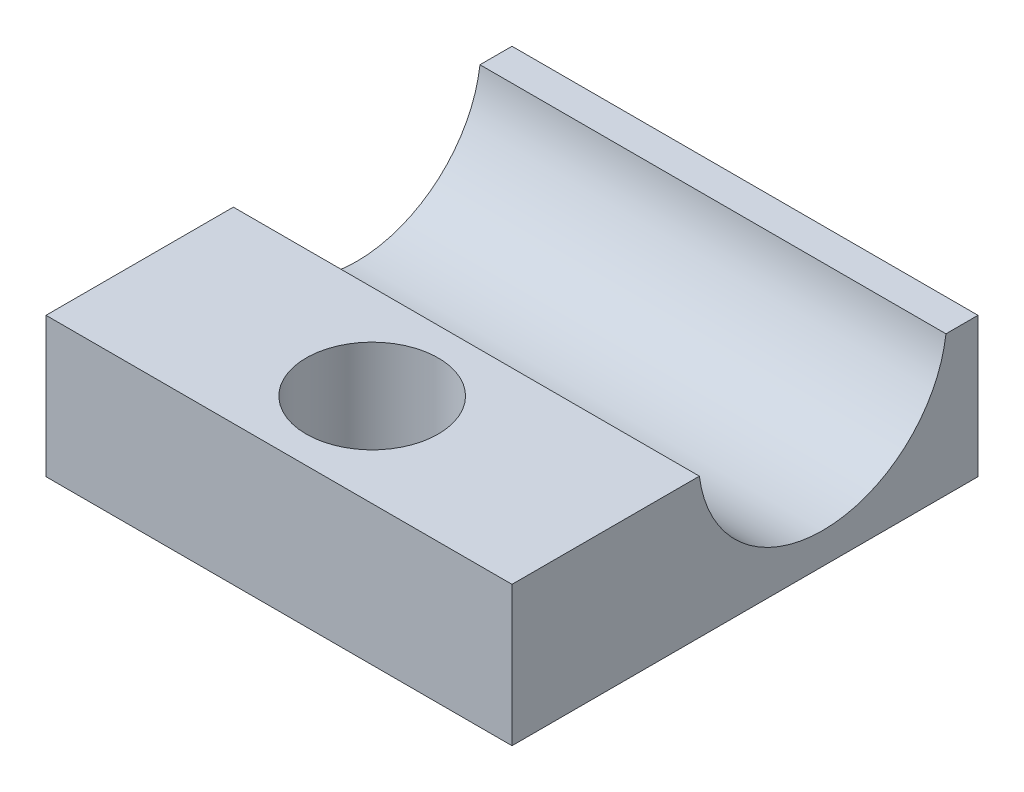
ISO-10303-21;
HEADER;
FILE_DESCRIPTION(('STEP AP214'),'2;1');
FILE_NAME('part.step','',(''),(''),'','','');
FILE_SCHEMA(('AUTOMOTIVE_DESIGN { 1 0 10303 214 1 1 1 1 }'));
ENDSEC;
DATA;
#1=APPLICATION_CONTEXT('core data for automotive mechanical design processes');
#2=APPLICATION_PROTOCOL_DEFINITION('international standard','automotive_design',2000,#1);
#3=PRODUCT_CONTEXT('',#1,'mechanical');
#4=PRODUCT('Part','Part','',(#3));
#5=PRODUCT_RELATED_PRODUCT_CATEGORY('part','',(#4));
#6=PRODUCT_DEFINITION_FORMATION('','',#4);
#7=PRODUCT_DEFINITION_CONTEXT('part definition',#1,'design');
#8=PRODUCT_DEFINITION('design','',#6,#7);
#9=PRODUCT_DEFINITION_SHAPE('','',#8);
#10=(LENGTH_UNIT() NAMED_UNIT(*) SI_UNIT(.MILLI.,.METRE.));
#11=(NAMED_UNIT(*) PLANE_ANGLE_UNIT() SI_UNIT($,.RADIAN.));
#12=(NAMED_UNIT(*) SI_UNIT($,.STERADIAN.) SOLID_ANGLE_UNIT());
#13=UNCERTAINTY_MEASURE_WITH_UNIT(LENGTH_MEASURE(1.E-05),#10,'distance_accuracy_value','');
#14=(GEOMETRIC_REPRESENTATION_CONTEXT(3) GLOBAL_UNCERTAINTY_ASSIGNED_CONTEXT((#13)) GLOBAL_UNIT_ASSIGNED_CONTEXT((#10,
#11,#12)) REPRESENTATION_CONTEXT('',''));
#15=CARTESIAN_POINT('',(0.,0.,0.));
#16=DIRECTION('',(0.,0.,1.));
#17=DIRECTION('',(1.,0.,0.));
#18=AXIS2_PLACEMENT_3D('',#15,#16,#17);
#19=CARTESIAN_POINT('',(0.,4.5,0.));
#20=DIRECTION('',(0.,1.,0.));
#21=DIRECTION('',(0.,0.,1.));
#22=AXIS2_PLACEMENT_3D('',#19,#20,#21);
#23=PLANE('',#22);
#24=DIRECTION('',(1.,0.,0.));
#25=VECTOR('',#24,1.);
#26=CARTESIAN_POINT('',(-15.0010000000001,4.5,-6.03137303340308));
#27=LINE('',#26,#25);
#28=CARTESIAN_POINT('',(0.,4.5,-6.03137303340308));
#29=VERTEX_POINT('',#28);
#30=CARTESIAN_POINT('',(-15.0000000000001,4.5,-6.03137303340308));
#31=VERTEX_POINT('',#30);
#32=EDGE_CURVE('E51',#29,#31,#27,.F.);
#33=ORIENTED_EDGE('',*,*,#32,.T.);
#34=DIRECTION('',(0.,0.,1.));
#35=VECTOR('',#34,1.);
#36=CARTESIAN_POINT('',(-15.0000000000001,4.5,-15.));
#37=LINE('',#36,#35);
#38=CARTESIAN_POINT('',(-15.0000000000001,4.5,0.));
#39=VERTEX_POINT('',#38);
#40=EDGE_CURVE('E88',#31,#39,#37,.T.);
#41=ORIENTED_EDGE('',*,*,#40,.T.);
#42=DIRECTION('',(1.,0.,0.));
#43=VECTOR('',#42,1.);
#44=CARTESIAN_POINT('',(-15.0000000000001,4.5,0.));
#45=LINE('',#44,#43);
#46=CARTESIAN_POINT('',(0.,4.5,0.));
#47=VERTEX_POINT('',#46);
#48=EDGE_CURVE('E111',#39,#47,#45,.T.);
#49=ORIENTED_EDGE('',*,*,#48,.T.);
#50=DIRECTION('',(0.,0.,-1.));
#51=VECTOR('',#50,1.);
#52=CARTESIAN_POINT('',(0.,4.5,-15.));
#53=LINE('',#52,#51);
#54=EDGE_CURVE('E118',#47,#29,#53,.T.);
#55=ORIENTED_EDGE('',*,*,#54,.T.);
#56=EDGE_LOOP('',(#33,#41,#49,#55));
#57=FACE_BOUND('',#56,.T.);
#58=CARTESIAN_POINT('',(-7.5,4.5,-3.));
#59=DIRECTION('',(0.,1.,0.));
#60=DIRECTION('',(0.,0.,1.));
#61=AXIS2_PLACEMENT_3D('',#58,#59,#60);
#62=CIRCLE('',#61,2.125);
#63=CARTESIAN_POINT('',(-7.5,4.5,-0.875000000000001));
#64=VERTEX_POINT('',#63);
#65=EDGE_CURVE('E127',#64,#64,#62,.T.);
#66=ORIENTED_EDGE('',*,*,#65,.F.);
#67=EDGE_LOOP('',(#66));
#68=FACE_BOUND('',#67,.T.);
#69=ADVANCED_FACE('F36',(#57,#68),#23,.T.);
#70=DIRECTION('',(1.,0.,0.));
#71=VECTOR('',#70,1.);
#72=CARTESIAN_POINT('',(-15.0010000000002,4.5,-13.9686269665969));
#73=LINE('',#72,#71);
#74=CARTESIAN_POINT('',(-15.0000000000001,4.5,-13.9686269665969));
#75=VERTEX_POINT('',#74);
#76=CARTESIAN_POINT('',(0.,4.5,-13.9686269665969));
#77=VERTEX_POINT('',#76);
#78=EDGE_CURVE('E97',#75,#77,#73,.T.);
#79=ORIENTED_EDGE('',*,*,#78,.T.);
#80=CARTESIAN_POINT('',(0.,4.5,-15.));
#81=VERTEX_POINT('',#80);
#82=EDGE_CURVE('E113',#77,#81,#53,.T.);
#83=ORIENTED_EDGE('',*,*,#82,.T.);
#84=DIRECTION('',(-1.,0.,0.));
#85=VECTOR('',#84,1.);
#86=CARTESIAN_POINT('',(-15.0000000000001,4.5,-15.));
#87=LINE('',#86,#85);
#88=CARTESIAN_POINT('',(-15.0000000000001,4.5,-15.));
#89=VERTEX_POINT('',#88);
#90=EDGE_CURVE('E60',#81,#89,#87,.T.);
#91=ORIENTED_EDGE('',*,*,#90,.T.);
#92=EDGE_CURVE('E106',#89,#75,#37,.T.);
#93=ORIENTED_EDGE('',*,*,#92,.T.);
#94=EDGE_LOOP('',(#79,#83,#91,#93));
#95=FACE_BOUND('',#94,.T.);
#96=ADVANCED_FACE('F110',(#95),#23,.T.);
#97=CARTESIAN_POINT('',(0.,0.,0.));
#98=DIRECTION('',(0.,1.,0.));
#99=DIRECTION('',(0.,0.,1.));
#100=AXIS2_PLACEMENT_3D('',#97,#98,#99);
#101=PLANE('',#100);
#102=DIRECTION('',(0.,0.,1.));
#103=VECTOR('',#102,1.);
#104=CARTESIAN_POINT('',(-15.0000000000001,0.,-15.));
#105=LINE('',#104,#103);
#106=CARTESIAN_POINT('',(-15.0000000000001,0.,-15.));
#107=VERTEX_POINT('',#106);
#108=CARTESIAN_POINT('',(-15.0000000000001,0.,0.));
#109=VERTEX_POINT('',#108);
#110=EDGE_CURVE('E123',#107,#109,#105,.T.);
#111=ORIENTED_EDGE('',*,*,#110,.F.);
#112=DIRECTION('',(-1.,0.,0.));
#113=VECTOR('',#112,1.);
#114=CARTESIAN_POINT('',(-15.0000000000001,0.,-15.));
#115=LINE('',#114,#113);
#116=CARTESIAN_POINT('',(0.,0.,-15.));
#117=VERTEX_POINT('',#116);
#118=EDGE_CURVE('E81',#117,#107,#115,.T.);
#119=ORIENTED_EDGE('',*,*,#118,.F.);
#120=DIRECTION('',(0.,0.,-1.));
#121=VECTOR('',#120,1.);
#122=CARTESIAN_POINT('',(0.,0.,-15.));
#123=LINE('',#122,#121);
#124=CARTESIAN_POINT('',(0.,0.,0.));
#125=VERTEX_POINT('',#124);
#126=EDGE_CURVE('E129',#125,#117,#123,.T.);
#127=ORIENTED_EDGE('',*,*,#126,.F.);
#128=DIRECTION('',(1.,0.,0.));
#129=VECTOR('',#128,1.);
#130=CARTESIAN_POINT('',(-15.0000000000001,0.,0.));
#131=LINE('',#130,#129);
#132=EDGE_CURVE('E126',#109,#125,#131,.T.);
#133=ORIENTED_EDGE('',*,*,#132,.F.);
#134=EDGE_LOOP('',(#111,#119,#127,#133));
#135=FACE_BOUND('',#134,.T.);
#136=CARTESIAN_POINT('',(-7.5,0.,-3.));
#137=DIRECTION('',(0.,1.,0.));
#138=DIRECTION('',(0.,0.,1.));
#139=AXIS2_PLACEMENT_3D('',#136,#137,#138);
#140=CIRCLE('',#139,2.125);
#141=CARTESIAN_POINT('',(-7.5,0.,-0.875000000000001));
#142=VERTEX_POINT('',#141);
#143=EDGE_CURVE('E108',#142,#142,#140,.T.);
#144=ORIENTED_EDGE('',*,*,#143,.T.);
#145=EDGE_LOOP('',(#144));
#146=FACE_BOUND('',#145,.T.);
#147=ADVANCED_FACE('F144',(#135,#146),#101,.F.);
#148=CARTESIAN_POINT('',(-15.0000000000001,4.5,-15.));
#149=DIRECTION('',(1.,0.,0.));
#150=DIRECTION('',(0.,0.,-1.));
#151=AXIS2_PLACEMENT_3D('',#148,#149,#150);
#152=PLANE('',#151);
#153=ORIENTED_EDGE('',*,*,#40,.F.);
#154=CARTESIAN_POINT('',(-15.0000000000001,5.,-9.99999999999997));
#155=DIRECTION('',(1.,0.,0.));
#156=DIRECTION('',(0.,0.,-1.));
#157=AXIS2_PLACEMENT_3D('',#154,#155,#156);
#158=CIRCLE('',#157,4.);
#159=EDGE_CURVE('E100',#75,#31,#158,.F.);
#160=ORIENTED_EDGE('',*,*,#159,.F.);
#161=ORIENTED_EDGE('',*,*,#92,.F.);
#162=DIRECTION('',(0.,-1.,0.));
#163=VECTOR('',#162,1.);
#164=CARTESIAN_POINT('',(-15.0000000000001,4.5,-15.));
#165=LINE('',#164,#163);
#166=EDGE_CURVE('E122',#89,#107,#165,.T.);
#167=ORIENTED_EDGE('',*,*,#166,.T.);
#168=ORIENTED_EDGE('',*,*,#110,.T.);
#169=DIRECTION('',(0.,-1.,0.));
#170=VECTOR('',#169,1.);
#171=CARTESIAN_POINT('',(-15.0000000000001,4.5,0.));
#172=LINE('',#171,#170);
#173=EDGE_CURVE('E11',#39,#109,#172,.T.);
#174=ORIENTED_EDGE('',*,*,#173,.F.);
#175=EDGE_LOOP('',(#153,#160,#161,#167,#168,#174));
#176=FACE_BOUND('',#175,.T.);
#177=ADVANCED_FACE('F38',(#176),#152,.F.);
#178=CARTESIAN_POINT('',(-15.0000000000001,4.5,0.));
#179=DIRECTION('',(0.,0.,-1.));
#180=DIRECTION('',(-1.,0.,0.));
#181=AXIS2_PLACEMENT_3D('',#178,#179,#180);
#182=PLANE('',#181);
#183=ORIENTED_EDGE('',*,*,#132,.T.);
#184=DIRECTION('',(0.,-1.,0.));
#185=VECTOR('',#184,1.);
#186=CARTESIAN_POINT('',(0.,4.5,0.));
#187=LINE('',#186,#185);
#188=EDGE_CURVE('E44',#47,#125,#187,.T.);
#189=ORIENTED_EDGE('',*,*,#188,.F.);
#190=ORIENTED_EDGE('',*,*,#48,.F.);
#191=ORIENTED_EDGE('',*,*,#173,.T.);
#192=EDGE_LOOP('',(#183,#189,#190,#191));
#193=FACE_BOUND('',#192,.T.);
#194=ADVANCED_FACE('F149',(#193),#182,.F.);
#195=CARTESIAN_POINT('',(0.,4.5,-15.));
#196=DIRECTION('',(-1.,0.,0.));
#197=DIRECTION('',(0.,0.,1.));
#198=AXIS2_PLACEMENT_3D('',#195,#196,#197);
#199=PLANE('',#198);
#200=ORIENTED_EDGE('',*,*,#82,.F.);
#201=CARTESIAN_POINT('',(0.,5.,-10.));
#202=DIRECTION('',(1.,0.,0.));
#203=DIRECTION('',(0.,0.,-1.));
#204=AXIS2_PLACEMENT_3D('',#201,#202,#203);
#205=CIRCLE('',#204,4.);
#206=EDGE_CURVE('E101',#29,#77,#205,.T.);
#207=ORIENTED_EDGE('',*,*,#206,.F.);
#208=ORIENTED_EDGE('',*,*,#54,.F.);
#209=ORIENTED_EDGE('',*,*,#188,.T.);
#210=ORIENTED_EDGE('',*,*,#126,.T.);
#211=DIRECTION('',(0.,-1.,0.));
#212=VECTOR('',#211,1.);
#213=CARTESIAN_POINT('',(0.,4.5,-15.));
#214=LINE('',#213,#212);
#215=EDGE_CURVE('E133',#81,#117,#214,.T.);
#216=ORIENTED_EDGE('',*,*,#215,.F.);
#217=EDGE_LOOP('',(#200,#207,#208,#209,#210,#216));
#218=FACE_BOUND('',#217,.T.);
#219=ADVANCED_FACE('F139',(#218),#199,.F.);
#220=CARTESIAN_POINT('',(-15.0000000000001,4.5,-15.));
#221=DIRECTION('',(0.,0.,1.));
#222=DIRECTION('',(1.,0.,0.));
#223=AXIS2_PLACEMENT_3D('',#220,#221,#222);
#224=PLANE('',#223);
#225=ORIENTED_EDGE('',*,*,#118,.T.);
#226=ORIENTED_EDGE('',*,*,#166,.F.);
#227=ORIENTED_EDGE('',*,*,#90,.F.);
#228=ORIENTED_EDGE('',*,*,#215,.T.);
#229=EDGE_LOOP('',(#225,#226,#227,#228));
#230=FACE_BOUND('',#229,.T.);
#231=ADVANCED_FACE('F146',(#230),#224,.F.);
#232=CARTESIAN_POINT('',(-7.5,4.5,-3.));
#233=DIRECTION('',(0.,-1.,0.));
#234=DIRECTION('',(0.,0.,-1.));
#235=AXIS2_PLACEMENT_3D('',#232,#233,#234);
#236=CYLINDRICAL_SURFACE('',#235,2.125);
#237=ORIENTED_EDGE('',*,*,#65,.T.);
#238=EDGE_LOOP('',(#237));
#239=FACE_BOUND('',#238,.T.);
#240=ORIENTED_EDGE('',*,*,#143,.F.);
#241=EDGE_LOOP('',(#240));
#242=FACE_BOUND('',#241,.T.);
#243=ADVANCED_FACE('F163',(#239,#242),#236,.F.);
#244=CARTESIAN_POINT('',(-15.0010000000002,5.,-9.99999999999997));
#245=DIRECTION('',(1.,0.,0.));
#246=DIRECTION('',(0.,0.,-1.));
#247=AXIS2_PLACEMENT_3D('',#244,#245,#246);
#248=CYLINDRICAL_SURFACE('',#247,4.);
#249=ORIENTED_EDGE('',*,*,#206,.T.);
#250=ORIENTED_EDGE('',*,*,#78,.F.);
#251=ORIENTED_EDGE('',*,*,#159,.T.);
#252=ORIENTED_EDGE('',*,*,#32,.F.);
#253=EDGE_LOOP('',(#249,#250,#251,#252));
#254=FACE_BOUND('',#253,.T.);
#255=ADVANCED_FACE('F99',(#254),#248,.F.);
#256=CLOSED_SHELL('',(#69,#96,#147,#177,#194,#219,#231,#243,#255));
#257=MANIFOLD_SOLID_BREP('B2',#256);
#258=ADVANCED_BREP_SHAPE_REPRESENTATION('',(#18,#257),#14);
#259=SHAPE_DEFINITION_REPRESENTATION(#9,#258);
ENDSEC;
END-ISO-10303-21;
